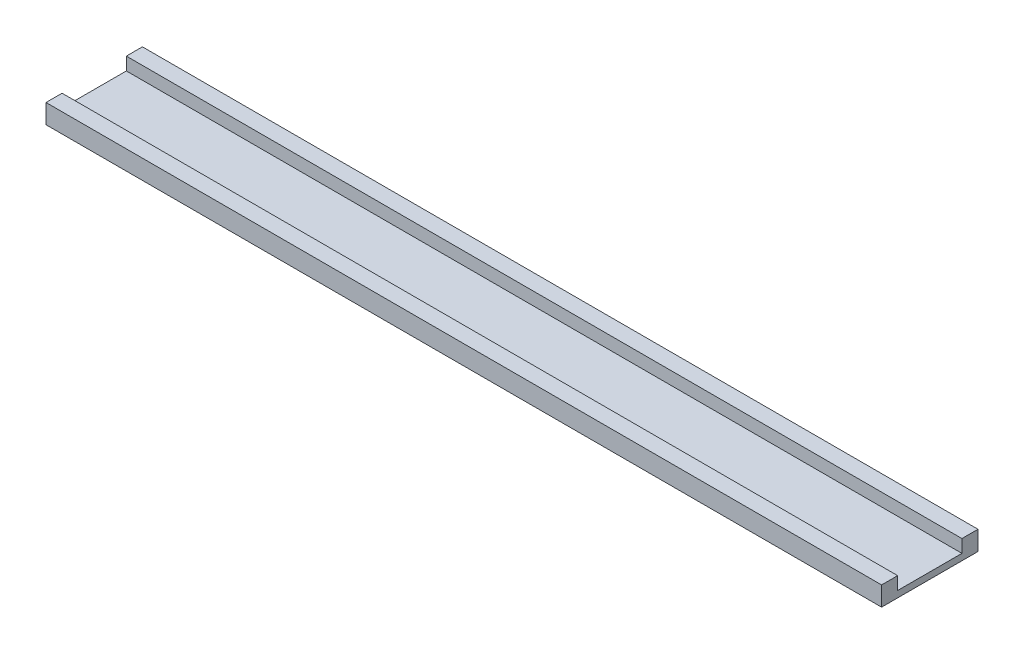
ISO-10303-21;
HEADER;
FILE_DESCRIPTION(('STEP AP214'),'2;1');
FILE_NAME('part.step','',(''),(''),'','','');
FILE_SCHEMA(('AUTOMOTIVE_DESIGN { 1 0 10303 214 1 1 1 1 }'));
ENDSEC;
DATA;
#1=APPLICATION_CONTEXT('core data for automotive mechanical design processes');
#2=APPLICATION_PROTOCOL_DEFINITION('international standard','automotive_design',2000,#1);
#3=PRODUCT_CONTEXT('',#1,'mechanical');
#4=PRODUCT('Part','Part','',(#3));
#5=PRODUCT_RELATED_PRODUCT_CATEGORY('part','',(#4));
#6=PRODUCT_DEFINITION_FORMATION('','',#4);
#7=PRODUCT_DEFINITION_CONTEXT('part definition',#1,'design');
#8=PRODUCT_DEFINITION('design','',#6,#7);
#9=PRODUCT_DEFINITION_SHAPE('','',#8);
#10=(LENGTH_UNIT() NAMED_UNIT(*) SI_UNIT(.MILLI.,.METRE.));
#11=(NAMED_UNIT(*) PLANE_ANGLE_UNIT() SI_UNIT($,.RADIAN.));
#12=(NAMED_UNIT(*) SI_UNIT($,.STERADIAN.) SOLID_ANGLE_UNIT());
#13=UNCERTAINTY_MEASURE_WITH_UNIT(LENGTH_MEASURE(1.E-05),#10,'distance_accuracy_value','');
#14=(GEOMETRIC_REPRESENTATION_CONTEXT(3) GLOBAL_UNCERTAINTY_ASSIGNED_CONTEXT((#13)) GLOBAL_UNIT_ASSIGNED_CONTEXT((#10,
#11,#12)) REPRESENTATION_CONTEXT('',''));
#15=CARTESIAN_POINT('',(0.,0.,0.));
#16=DIRECTION('',(0.,0.,1.));
#17=DIRECTION('',(1.,0.,0.));
#18=AXIS2_PLACEMENT_3D('',#15,#16,#17);
#19=CARTESIAN_POINT('',(0.,3.,0.));
#20=DIRECTION('',(0.,1.,0.));
#21=DIRECTION('',(0.,0.,1.));
#22=AXIS2_PLACEMENT_3D('',#19,#20,#21);
#23=PLANE('',#22);
#24=DIRECTION('',(1.,0.,0.));
#25=VECTOR('',#24,1.);
#26=CARTESIAN_POINT('',(-65.,3.,5.));
#27=LINE('',#26,#25);
#28=CARTESIAN_POINT('',(-65.,3.,5.));
#29=VERTEX_POINT('',#28);
#30=CARTESIAN_POINT('',(65.,3.,5.));
#31=VERTEX_POINT('',#30);
#32=EDGE_CURVE('E132',#29,#31,#27,.T.);
#33=ORIENTED_EDGE('',*,*,#32,.F.);
#34=DIRECTION('',(0.,0.,1.));
#35=VECTOR('',#34,1.);
#36=CARTESIAN_POINT('',(-65.,3.,-7.5));
#37=LINE('',#36,#35);
#38=CARTESIAN_POINT('',(-65.,3.,7.5));
#39=VERTEX_POINT('',#38);
#40=EDGE_CURVE('E150',#29,#39,#37,.T.);
#41=ORIENTED_EDGE('',*,*,#40,.T.);
#42=DIRECTION('',(1.,0.,0.));
#43=VECTOR('',#42,1.);
#44=CARTESIAN_POINT('',(-65.,3.,7.5));
#45=LINE('',#44,#43);
#46=CARTESIAN_POINT('',(65.,3.,7.5));
#47=VERTEX_POINT('',#46);
#48=EDGE_CURVE('E64',#39,#47,#45,.T.);
#49=ORIENTED_EDGE('',*,*,#48,.T.);
#50=DIRECTION('',(0.,0.,-1.));
#51=VECTOR('',#50,1.);
#52=CARTESIAN_POINT('',(65.,3.,-7.5));
#53=LINE('',#52,#51);
#54=EDGE_CURVE('E144',#47,#31,#53,.T.);
#55=ORIENTED_EDGE('',*,*,#54,.T.);
#56=EDGE_LOOP('',(#33,#41,#49,#55));
#57=FACE_BOUND('',#56,.T.);
#58=ADVANCED_FACE('F39',(#57),#23,.T.);
#59=CARTESIAN_POINT('',(65.,3.,-7.5));
#60=DIRECTION('',(-1.,0.,0.));
#61=DIRECTION('',(0.,0.,1.));
#62=AXIS2_PLACEMENT_3D('',#59,#60,#61);
#63=PLANE('',#62);
#64=DIRECTION('',(0.,0.,-1.));
#65=VECTOR('',#64,1.);
#66=CARTESIAN_POINT('',(65.,1.,-5.));
#67=LINE('',#66,#65);
#68=CARTESIAN_POINT('',(65.,1.,5.));
#69=VERTEX_POINT('',#68);
#70=CARTESIAN_POINT('',(65.,1.,-5.));
#71=VERTEX_POINT('',#70);
#72=EDGE_CURVE('E122',#69,#71,#67,.T.);
#73=ORIENTED_EDGE('',*,*,#72,.F.);
#74=DIRECTION('',(0.,1.,0.));
#75=VECTOR('',#74,1.);
#76=CARTESIAN_POINT('',(65.,1.,5.));
#77=LINE('',#76,#75);
#78=EDGE_CURVE('E163',#69,#31,#77,.T.);
#79=ORIENTED_EDGE('',*,*,#78,.T.);
#80=ORIENTED_EDGE('',*,*,#54,.F.);
#81=DIRECTION('',(0.,-1.,0.));
#82=VECTOR('',#81,1.);
#83=CARTESIAN_POINT('',(65.,3.,7.5));
#84=LINE('',#83,#82);
#85=CARTESIAN_POINT('',(65.,0.,7.5));
#86=VERTEX_POINT('',#85);
#87=EDGE_CURVE('E157',#47,#86,#84,.T.);
#88=ORIENTED_EDGE('',*,*,#87,.T.);
#89=DIRECTION('',(0.,0.,-1.));
#90=VECTOR('',#89,1.);
#91=CARTESIAN_POINT('',(65.,0.,-7.5));
#92=LINE('',#91,#90);
#93=CARTESIAN_POINT('',(65.,0.,-7.5));
#94=VERTEX_POINT('',#93);
#95=EDGE_CURVE('E158',#86,#94,#92,.T.);
#96=ORIENTED_EDGE('',*,*,#95,.T.);
#97=DIRECTION('',(0.,-1.,0.));
#98=VECTOR('',#97,1.);
#99=CARTESIAN_POINT('',(65.,3.,-7.5));
#100=LINE('',#99,#98);
#101=CARTESIAN_POINT('',(65.,3.,-7.5));
#102=VERTEX_POINT('',#101);
#103=EDGE_CURVE('E11',#102,#94,#100,.T.);
#104=ORIENTED_EDGE('',*,*,#103,.F.);
#105=CARTESIAN_POINT('',(65.,3.,-5.));
#106=VERTEX_POINT('',#105);
#107=EDGE_CURVE('E92',#106,#102,#53,.T.);
#108=ORIENTED_EDGE('',*,*,#107,.F.);
#109=DIRECTION('',(0.,1.,0.));
#110=VECTOR('',#109,1.);
#111=CARTESIAN_POINT('',(65.,1.,-5.));
#112=LINE('',#111,#110);
#113=EDGE_CURVE('E55',#71,#106,#112,.T.);
#114=ORIENTED_EDGE('',*,*,#113,.F.);
#115=EDGE_LOOP('',(#73,#79,#80,#88,#96,#104,#108,#114));
#116=FACE_BOUND('',#115,.T.);
#117=ADVANCED_FACE('F41',(#116),#63,.F.);
#118=CARTESIAN_POINT('',(-65.,3.,-7.5));
#119=DIRECTION('',(0.,0.,1.));
#120=DIRECTION('',(1.,0.,0.));
#121=AXIS2_PLACEMENT_3D('',#118,#119,#120);
#122=PLANE('',#121);
#123=DIRECTION('',(-1.,0.,0.));
#124=VECTOR('',#123,1.);
#125=CARTESIAN_POINT('',(-65.,0.,-7.5));
#126=LINE('',#125,#124);
#127=CARTESIAN_POINT('',(-65.,0.,-7.5));
#128=VERTEX_POINT('',#127);
#129=EDGE_CURVE('E162',#94,#128,#126,.T.);
#130=ORIENTED_EDGE('',*,*,#129,.T.);
#131=DIRECTION('',(0.,-1.,0.));
#132=VECTOR('',#131,1.);
#133=CARTESIAN_POINT('',(-65.,3.,-7.5));
#134=LINE('',#133,#132);
#135=CARTESIAN_POINT('',(-65.,3.,-7.5));
#136=VERTEX_POINT('',#135);
#137=EDGE_CURVE('E48',#136,#128,#134,.T.);
#138=ORIENTED_EDGE('',*,*,#137,.F.);
#139=DIRECTION('',(-1.,0.,0.));
#140=VECTOR('',#139,1.);
#141=CARTESIAN_POINT('',(-65.,3.,-7.5));
#142=LINE('',#141,#140);
#143=EDGE_CURVE('E147',#102,#136,#142,.T.);
#144=ORIENTED_EDGE('',*,*,#143,.F.);
#145=ORIENTED_EDGE('',*,*,#103,.T.);
#146=EDGE_LOOP('',(#130,#138,#144,#145));
#147=FACE_BOUND('',#146,.T.);
#148=ADVANCED_FACE('F212',(#147),#122,.F.);
#149=CARTESIAN_POINT('',(-65.,3.,-7.5));
#150=DIRECTION('',(1.,0.,0.));
#151=DIRECTION('',(0.,0.,-1.));
#152=AXIS2_PLACEMENT_3D('',#149,#150,#151);
#153=PLANE('',#152);
#154=ORIENTED_EDGE('',*,*,#40,.F.);
#155=DIRECTION('',(0.,1.,0.));
#156=VECTOR('',#155,1.);
#157=CARTESIAN_POINT('',(-65.,1.,5.));
#158=LINE('',#157,#156);
#159=CARTESIAN_POINT('',(-65.,1.,5.));
#160=VERTEX_POINT('',#159);
#161=EDGE_CURVE('E139',#160,#29,#158,.T.);
#162=ORIENTED_EDGE('',*,*,#161,.F.);
#163=DIRECTION('',(0.,0.,1.));
#164=VECTOR('',#163,1.);
#165=CARTESIAN_POINT('',(-65.,1.,-5.));
#166=LINE('',#165,#164);
#167=CARTESIAN_POINT('',(-65.,1.,-5.));
#168=VERTEX_POINT('',#167);
#169=EDGE_CURVE('E121',#168,#160,#166,.T.);
#170=ORIENTED_EDGE('',*,*,#169,.F.);
#171=DIRECTION('',(0.,1.,0.));
#172=VECTOR('',#171,1.);
#173=CARTESIAN_POINT('',(-65.,1.,-5.));
#174=LINE('',#173,#172);
#175=CARTESIAN_POINT('',(-65.,3.,-5.));
#176=VERTEX_POINT('',#175);
#177=EDGE_CURVE('E117',#168,#176,#174,.T.);
#178=ORIENTED_EDGE('',*,*,#177,.T.);
#179=EDGE_CURVE('E151',#136,#176,#37,.T.);
#180=ORIENTED_EDGE('',*,*,#179,.F.);
#181=ORIENTED_EDGE('',*,*,#137,.T.);
#182=DIRECTION('',(0.,0.,1.));
#183=VECTOR('',#182,1.);
#184=CARTESIAN_POINT('',(-65.,0.,-7.5));
#185=LINE('',#184,#183);
#186=CARTESIAN_POINT('',(-65.,0.,7.5));
#187=VERTEX_POINT('',#186);
#188=EDGE_CURVE('E166',#128,#187,#185,.T.);
#189=ORIENTED_EDGE('',*,*,#188,.T.);
#190=DIRECTION('',(0.,-1.,0.));
#191=VECTOR('',#190,1.);
#192=CARTESIAN_POINT('',(-65.,3.,7.5));
#193=LINE('',#192,#191);
#194=EDGE_CURVE('E173',#39,#187,#193,.T.);
#195=ORIENTED_EDGE('',*,*,#194,.F.);
#196=EDGE_LOOP('',(#154,#162,#170,#178,#180,#181,#189,#195));
#197=FACE_BOUND('',#196,.T.);
#198=ADVANCED_FACE('F182',(#197),#153,.F.);
#199=CARTESIAN_POINT('',(-65.,3.,7.5));
#200=DIRECTION('',(0.,0.,-1.));
#201=DIRECTION('',(-1.,0.,0.));
#202=AXIS2_PLACEMENT_3D('',#199,#200,#201);
#203=PLANE('',#202);
#204=DIRECTION('',(1.,0.,0.));
#205=VECTOR('',#204,1.);
#206=CARTESIAN_POINT('',(-65.,0.,7.5));
#207=LINE('',#206,#205);
#208=EDGE_CURVE('E85',#187,#86,#207,.T.);
#209=ORIENTED_EDGE('',*,*,#208,.T.);
#210=ORIENTED_EDGE('',*,*,#87,.F.);
#211=ORIENTED_EDGE('',*,*,#48,.F.);
#212=ORIENTED_EDGE('',*,*,#194,.T.);
#213=EDGE_LOOP('',(#209,#210,#211,#212));
#214=FACE_BOUND('',#213,.T.);
#215=ADVANCED_FACE('F189',(#214),#203,.F.);
#216=DIRECTION('',(-1.,0.,0.));
#217=VECTOR('',#216,1.);
#218=CARTESIAN_POINT('',(-65.,3.,-5.));
#219=LINE('',#218,#217);
#220=EDGE_CURVE('E201',#106,#176,#219,.T.);
#221=ORIENTED_EDGE('',*,*,#220,.F.);
#222=ORIENTED_EDGE('',*,*,#107,.T.);
#223=ORIENTED_EDGE('',*,*,#143,.T.);
#224=ORIENTED_EDGE('',*,*,#179,.T.);
#225=EDGE_LOOP('',(#221,#222,#223,#224));
#226=FACE_BOUND('',#225,.T.);
#227=ADVANCED_FACE('F208',(#226),#23,.T.);
#228=CARTESIAN_POINT('',(0.,0.,0.));
#229=DIRECTION('',(0.,1.,0.));
#230=DIRECTION('',(0.,0.,1.));
#231=AXIS2_PLACEMENT_3D('',#228,#229,#230);
#232=PLANE('',#231);
#233=ORIENTED_EDGE('',*,*,#95,.F.);
#234=ORIENTED_EDGE('',*,*,#208,.F.);
#235=ORIENTED_EDGE('',*,*,#188,.F.);
#236=ORIENTED_EDGE('',*,*,#129,.F.);
#237=EDGE_LOOP('',(#233,#234,#235,#236));
#238=FACE_BOUND('',#237,.T.);
#239=ADVANCED_FACE('F187',(#238),#232,.F.);
#240=CARTESIAN_POINT('',(-65.,1.,5.));
#241=DIRECTION('',(0.,0.,1.));
#242=DIRECTION('',(1.,0.,0.));
#243=AXIS2_PLACEMENT_3D('',#240,#241,#242);
#244=PLANE('',#243);
#245=ORIENTED_EDGE('',*,*,#32,.T.);
#246=ORIENTED_EDGE('',*,*,#78,.F.);
#247=DIRECTION('',(1.,0.,0.));
#248=VECTOR('',#247,1.);
#249=CARTESIAN_POINT('',(-65.,1.,5.));
#250=LINE('',#249,#248);
#251=EDGE_CURVE('E128',#160,#69,#250,.T.);
#252=ORIENTED_EDGE('',*,*,#251,.F.);
#253=ORIENTED_EDGE('',*,*,#161,.T.);
#254=EDGE_LOOP('',(#245,#246,#252,#253));
#255=FACE_BOUND('',#254,.T.);
#256=ADVANCED_FACE('F205',(#255),#244,.F.);
#257=CARTESIAN_POINT('',(-65.,1.,-5.));
#258=DIRECTION('',(0.,0.,-1.));
#259=DIRECTION('',(-1.,0.,0.));
#260=AXIS2_PLACEMENT_3D('',#257,#258,#259);
#261=PLANE('',#260);
#262=ORIENTED_EDGE('',*,*,#220,.T.);
#263=ORIENTED_EDGE('',*,*,#177,.F.);
#264=DIRECTION('',(-1.,0.,0.));
#265=VECTOR('',#264,1.);
#266=CARTESIAN_POINT('',(-65.,1.,-5.));
#267=LINE('',#266,#265);
#268=EDGE_CURVE('E113',#71,#168,#267,.T.);
#269=ORIENTED_EDGE('',*,*,#268,.F.);
#270=ORIENTED_EDGE('',*,*,#113,.T.);
#271=EDGE_LOOP('',(#262,#263,#269,#270));
#272=FACE_BOUND('',#271,.T.);
#273=ADVANCED_FACE('F115',(#272),#261,.F.);
#274=CARTESIAN_POINT('',(0.,1.,0.));
#275=DIRECTION('',(0.,1.,0.));
#276=DIRECTION('',(0.,0.,1.));
#277=AXIS2_PLACEMENT_3D('',#274,#275,#276);
#278=PLANE('',#277);
#279=ORIENTED_EDGE('',*,*,#72,.T.);
#280=ORIENTED_EDGE('',*,*,#268,.T.);
#281=ORIENTED_EDGE('',*,*,#169,.T.);
#282=ORIENTED_EDGE('',*,*,#251,.T.);
#283=EDGE_LOOP('',(#279,#280,#281,#282));
#284=FACE_BOUND('',#283,.T.);
#285=ADVANCED_FACE('F126',(#284),#278,.T.);
#286=CLOSED_SHELL('',(#58,#117,#148,#198,#215,#227,#239,#256,#273,#285));
#287=MANIFOLD_SOLID_BREP('B2',#286);
#288=ADVANCED_BREP_SHAPE_REPRESENTATION('',(#18,#287),#14);
#289=SHAPE_DEFINITION_REPRESENTATION(#9,#288);
ENDSEC;
END-ISO-10303-21;
